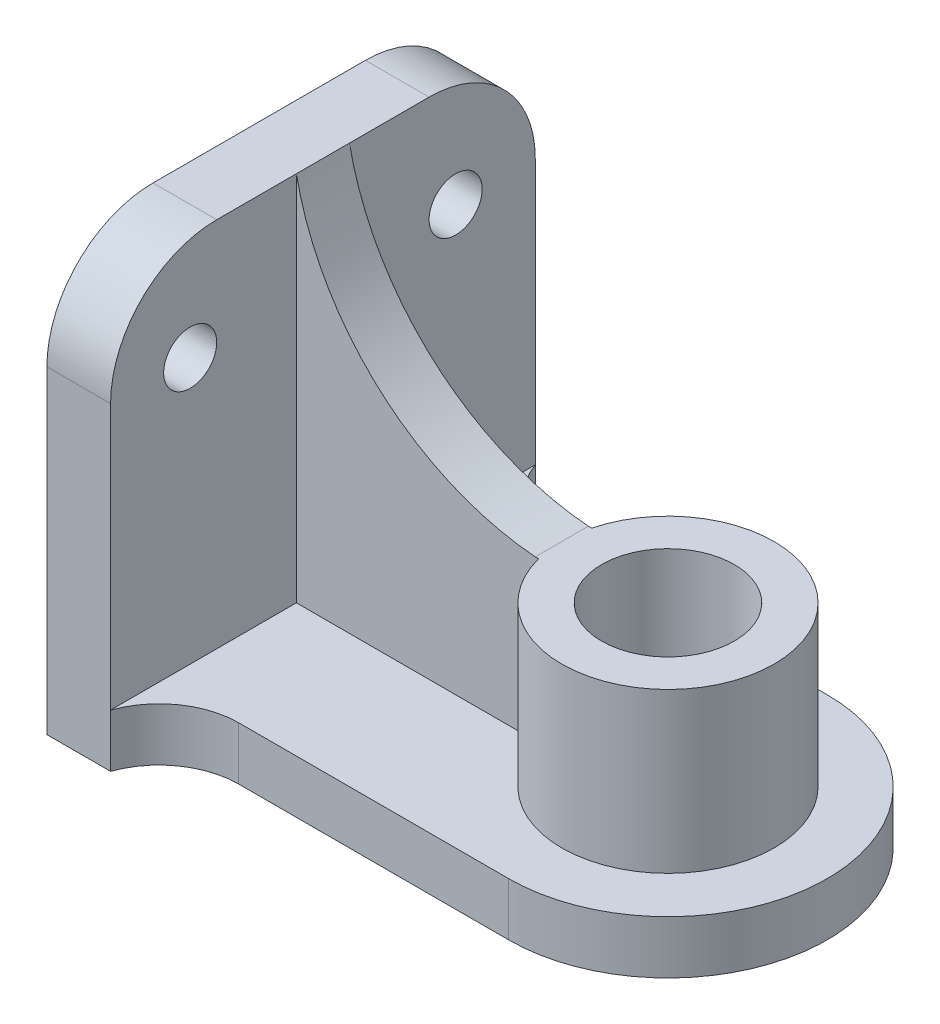
ISO-10303-21;
HEADER;
FILE_DESCRIPTION(('STEP AP214'),'2;1');
FILE_NAME('part.step','',(''),(''),'','','');
FILE_SCHEMA(('AUTOMOTIVE_DESIGN { 1 0 10303 214 1 1 1 1 }'));
ENDSEC;
DATA;
#1=APPLICATION_CONTEXT('core data for automotive mechanical design processes');
#2=APPLICATION_PROTOCOL_DEFINITION('international standard','automotive_design',2000,#1);
#3=PRODUCT_CONTEXT('',#1,'mechanical');
#4=PRODUCT('Part','Part','',(#3));
#5=PRODUCT_RELATED_PRODUCT_CATEGORY('part','',(#4));
#6=PRODUCT_DEFINITION_FORMATION('','',#4);
#7=PRODUCT_DEFINITION_CONTEXT('part definition',#1,'design');
#8=PRODUCT_DEFINITION('design','',#6,#7);
#9=PRODUCT_DEFINITION_SHAPE('','',#8);
#10=(LENGTH_UNIT() NAMED_UNIT(*) SI_UNIT(.MILLI.,.METRE.));
#11=(NAMED_UNIT(*) PLANE_ANGLE_UNIT() SI_UNIT($,.RADIAN.));
#12=(NAMED_UNIT(*) SI_UNIT($,.STERADIAN.) SOLID_ANGLE_UNIT());
#13=UNCERTAINTY_MEASURE_WITH_UNIT(LENGTH_MEASURE(1.E-05),#10,'distance_accuracy_value','');
#14=(GEOMETRIC_REPRESENTATION_CONTEXT(3) GLOBAL_UNCERTAINTY_ASSIGNED_CONTEXT((#13)) GLOBAL_UNIT_ASSIGNED_CONTEXT((#10,
#11,#12)) REPRESENTATION_CONTEXT('',''));
#15=CARTESIAN_POINT('',(0.,0.,0.));
#16=DIRECTION('',(0.,0.,1.));
#17=DIRECTION('',(1.,0.,0.));
#18=AXIS2_PLACEMENT_3D('',#15,#16,#17);
#19=CARTESIAN_POINT('',(12.,80.,0.));
#20=DIRECTION('',(-1.,0.,0.));
#21=DIRECTION('',(0.,0.,1.));
#22=AXIS2_PLACEMENT_3D('',#19,#20,#21);
#23=PLANE('',#22);
#24=CARTESIAN_POINT('',(12.,60.,15.));
#25=DIRECTION('',(1.,0.,0.));
#26=DIRECTION('',(0.,0.,-1.));
#27=AXIS2_PLACEMENT_3D('',#24,#25,#26);
#28=CIRCLE('',#27,5.);
#29=CARTESIAN_POINT('',(12.,60.,10.));
#30=VERTEX_POINT('',#29);
#31=EDGE_CURVE('E443',#30,#30,#28,.T.);
#32=ORIENTED_EDGE('',*,*,#31,.F.);
#33=EDGE_LOOP('',(#32));
#34=FACE_BOUND('',#33,.T.);
#35=DIRECTION('',(0.,-1.,0.));
#36=VECTOR('',#35,1.);
#37=CARTESIAN_POINT('',(12.,80.,35.));
#38=LINE('',#37,#36);
#39=CARTESIAN_POINT('',(12.,80.,35.));
#40=VERTEX_POINT('',#39);
#41=CARTESIAN_POINT('',(12.,10.,35.));
#42=VERTEX_POINT('',#41);
#43=EDGE_CURVE('E61',#40,#42,#38,.T.);
#44=ORIENTED_EDGE('',*,*,#43,.T.);
#45=DIRECTION('',(0.,0.,-1.));
#46=VECTOR('',#45,1.);
#47=CARTESIAN_POINT('',(12.,10.,0.));
#48=LINE('',#47,#46);
#49=CARTESIAN_POINT('',(12.,9.99999999999999,0.));
#50=VERTEX_POINT('',#49);
#51=EDGE_CURVE('E275',#42,#50,#48,.T.);
#52=ORIENTED_EDGE('',*,*,#51,.T.);
#53=DIRECTION('',(0.,-1.,0.));
#54=VECTOR('',#53,1.);
#55=CARTESIAN_POINT('',(12.,80.,0.));
#56=LINE('',#55,#54);
#57=CARTESIAN_POINT('',(12.,60.,0.));
#58=VERTEX_POINT('',#57);
#59=EDGE_CURVE('E252',#58,#50,#56,.T.);
#60=ORIENTED_EDGE('',*,*,#59,.F.);
#61=CARTESIAN_POINT('',(12.,60.,20.));
#62=DIRECTION('',(-1.,0.,0.));
#63=DIRECTION('',(0.,0.,1.));
#64=AXIS2_PLACEMENT_3D('',#61,#62,#63);
#65=CIRCLE('',#64,20.);
#66=CARTESIAN_POINT('',(12.,80.,20.));
#67=VERTEX_POINT('',#66);
#68=EDGE_CURVE('E54',#58,#67,#65,.F.);
#69=ORIENTED_EDGE('',*,*,#68,.T.);
#70=DIRECTION('',(0.,0.,-1.));
#71=VECTOR('',#70,1.);
#72=CARTESIAN_POINT('',(12.,80.,0.));
#73=LINE('',#72,#71);
#74=EDGE_CURVE('E233',#40,#67,#73,.T.);
#75=ORIENTED_EDGE('',*,*,#74,.F.);
#76=EDGE_LOOP('',(#44,#52,#60,#69,#75));
#77=FACE_BOUND('',#76,.T.);
#78=ADVANCED_FACE('F45',(#34,#77),#23,.F.);
#79=CARTESIAN_POINT('',(77.,10.,39.9999999999676));
#80=DIRECTION('',(0.,-1.,0.));
#81=DIRECTION('',(0.,0.,-1.));
#82=AXIS2_PLACEMENT_3D('',#79,#80,#81);
#83=CYLINDRICAL_SURFACE('',#82,30.);
#84=CARTESIAN_POINT('',(77.,0.,39.9999999999676));
#85=DIRECTION('',(0.,1.,0.));
#86=DIRECTION('',(0.,0.,1.));
#87=AXIS2_PLACEMENT_3D('',#84,#85,#86);
#88=CIRCLE('',#87,30.);
#89=CARTESIAN_POINT('',(77.,0.,69.9999999999676));
#90=VERTEX_POINT('',#89);
#91=CARTESIAN_POINT('',(77.,0.,9.9999999999676));
#92=VERTEX_POINT('',#91);
#93=EDGE_CURVE('E262',#90,#92,#88,.T.);
#94=ORIENTED_EDGE('',*,*,#93,.T.);
#95=DIRECTION('',(0.,-1.,0.));
#96=VECTOR('',#95,1.);
#97=CARTESIAN_POINT('',(77.,10.,9.9999999999676));
#98=LINE('',#97,#96);
#99=CARTESIAN_POINT('',(77.,10.,9.9999999999676));
#100=VERTEX_POINT('',#99);
#101=EDGE_CURVE('E323',#100,#92,#98,.T.);
#102=ORIENTED_EDGE('',*,*,#101,.F.);
#103=CARTESIAN_POINT('',(77.,10.,39.9999999999676));
#104=DIRECTION('',(0.,1.,0.));
#105=DIRECTION('',(0.,0.,1.));
#106=AXIS2_PLACEMENT_3D('',#103,#104,#105);
#107=CIRCLE('',#106,30.);
#108=CARTESIAN_POINT('',(77.,10.,69.9999999999676));
#109=VERTEX_POINT('',#108);
#110=EDGE_CURVE('E263',#109,#100,#107,.T.);
#111=ORIENTED_EDGE('',*,*,#110,.F.);
#112=DIRECTION('',(0.,-1.,0.));
#113=VECTOR('',#112,1.);
#114=CARTESIAN_POINT('',(77.,10.,69.9999999999676));
#115=LINE('',#114,#113);
#116=EDGE_CURVE('E290',#109,#90,#115,.T.);
#117=ORIENTED_EDGE('',*,*,#116,.T.);
#118=EDGE_LOOP('',(#94,#102,#111,#117));
#119=FACE_BOUND('',#118,.T.);
#120=ADVANCED_FACE('F398',(#119),#83,.T.);
#121=CARTESIAN_POINT('',(6.36887866620817E-12,10.,10.0000000000166));
#122=DIRECTION('',(6.36887866619757E-13,0.,1.));
#123=DIRECTION('',(1.,0.,-6.36887866619757E-13));
#124=AXIS2_PLACEMENT_3D('',#121,#122,#123);
#125=PLANE('',#124);
#126=DIRECTION('',(-1.,0.,6.36887866619757E-13));
#127=VECTOR('',#126,1.);
#128=CARTESIAN_POINT('',(6.36887866620817E-12,0.,10.0000000000166));
#129=LINE('',#128,#127);
#130=CARTESIAN_POINT('',(26.1421356237309,0.,9.99999999999999));
#131=VERTEX_POINT('',#130);
#132=EDGE_CURVE('E294',#92,#131,#129,.T.);
#133=ORIENTED_EDGE('',*,*,#132,.T.);
#134=DIRECTION('',(0.,-1.,0.));
#135=VECTOR('',#134,1.);
#136=CARTESIAN_POINT('',(26.1421356237309,10.,9.99999999999999));
#137=LINE('',#136,#135);
#138=CARTESIAN_POINT('',(26.1421356237309,10.,9.99999999999999));
#139=VERTEX_POINT('',#138);
#140=EDGE_CURVE('E319',#139,#131,#137,.T.);
#141=ORIENTED_EDGE('',*,*,#140,.F.);
#142=DIRECTION('',(-1.,0.,6.36887866619757E-13));
#143=VECTOR('',#142,1.);
#144=CARTESIAN_POINT('',(6.36887866620817E-12,10.,10.0000000000166));
#145=LINE('',#144,#143);
#146=EDGE_CURVE('E267',#100,#139,#145,.T.);
#147=ORIENTED_EDGE('',*,*,#146,.F.);
#148=ORIENTED_EDGE('',*,*,#101,.T.);
#149=EDGE_LOOP('',(#133,#141,#147,#148));
#150=FACE_BOUND('',#149,.T.);
#151=ADVANCED_FACE('F394',(#150),#125,.F.);
#152=CARTESIAN_POINT('',(26.142135623731,10.,-5.));
#153=DIRECTION('',(0.,-1.,0.));
#154=DIRECTION('',(0.,0.,-1.));
#155=AXIS2_PLACEMENT_3D('',#152,#153,#154);
#156=CYLINDRICAL_SURFACE('',#155,15.);
#157=CARTESIAN_POINT('',(26.142135623731,0.,-5.));
#158=DIRECTION('',(0.,1.,0.));
#159=DIRECTION('',(0.,0.,1.));
#160=AXIS2_PLACEMENT_3D('',#157,#158,#159);
#161=CIRCLE('',#160,15.);
#162=CARTESIAN_POINT('',(12.,0.,0.));
#163=VERTEX_POINT('',#162);
#164=EDGE_CURVE('E297',#131,#163,#161,.F.);
#165=ORIENTED_EDGE('',*,*,#164,.T.);
#166=DIRECTION('',(0.,-1.,0.));
#167=VECTOR('',#166,1.);
#168=CARTESIAN_POINT('',(12.,10.,0.));
#169=LINE('',#168,#167);
#170=EDGE_CURVE('E315',#50,#163,#169,.T.);
#171=ORIENTED_EDGE('',*,*,#170,.F.);
#172=CARTESIAN_POINT('',(26.142135623731,10.,-5.));
#173=DIRECTION('',(0.,1.,0.));
#174=DIRECTION('',(0.,0.,1.));
#175=AXIS2_PLACEMENT_3D('',#172,#173,#174);
#176=CIRCLE('',#175,15.);
#177=EDGE_CURVE('E271',#139,#50,#176,.F.);
#178=ORIENTED_EDGE('',*,*,#177,.F.);
#179=ORIENTED_EDGE('',*,*,#140,.T.);
#180=EDGE_LOOP('',(#165,#171,#178,#179));
#181=FACE_BOUND('',#180,.T.);
#182=ADVANCED_FACE('F390',(#181),#156,.F.);
#183=CARTESIAN_POINT('',(26.142135623731,10.,85.));
#184=DIRECTION('',(0.,-1.,0.));
#185=DIRECTION('',(0.,0.,-1.));
#186=AXIS2_PLACEMENT_3D('',#183,#184,#185);
#187=CYLINDRICAL_SURFACE('',#186,15.);
#188=CARTESIAN_POINT('',(26.142135623731,0.,85.));
#189=DIRECTION('',(0.,1.,0.));
#190=DIRECTION('',(0.,0.,1.));
#191=AXIS2_PLACEMENT_3D('',#188,#189,#190);
#192=CIRCLE('',#191,15.);
#193=CARTESIAN_POINT('',(26.1421356237309,0.,70.));
#194=VERTEX_POINT('',#193);
#195=CARTESIAN_POINT('',(12.,0.,80.));
#196=VERTEX_POINT('',#195);
#197=EDGE_CURVE('E300',#194,#196,#192,.T.);
#198=ORIENTED_EDGE('',*,*,#197,.F.);
#199=DIRECTION('',(0.,-1.,0.));
#200=VECTOR('',#199,1.);
#201=CARTESIAN_POINT('',(26.1421356237309,10.,70.));
#202=LINE('',#201,#200);
#203=CARTESIAN_POINT('',(26.1421356237309,10.,70.));
#204=VERTEX_POINT('',#203);
#205=EDGE_CURVE('E309',#204,#194,#202,.T.);
#206=ORIENTED_EDGE('',*,*,#205,.F.);
#207=CARTESIAN_POINT('',(26.142135623731,10.,85.));
#208=DIRECTION('',(0.,1.,0.));
#209=DIRECTION('',(0.,0.,1.));
#210=AXIS2_PLACEMENT_3D('',#207,#208,#209);
#211=CIRCLE('',#210,15.);
#212=CARTESIAN_POINT('',(12.,10.,80.));
#213=VERTEX_POINT('',#212);
#214=EDGE_CURVE('E279',#204,#213,#211,.T.);
#215=ORIENTED_EDGE('',*,*,#214,.T.);
#216=DIRECTION('',(0.,-1.,0.));
#217=VECTOR('',#216,1.);
#218=CARTESIAN_POINT('',(12.,10.,80.));
#219=LINE('',#218,#217);
#220=EDGE_CURVE('E312',#213,#196,#219,.T.);
#221=ORIENTED_EDGE('',*,*,#220,.T.);
#222=EDGE_LOOP('',(#198,#206,#215,#221));
#223=FACE_BOUND('',#222,.T.);
#224=ADVANCED_FACE('F375',(#223),#187,.F.);
#225=CARTESIAN_POINT('',(4.46012518419127E-11,10.,70.0000000000167));
#226=DIRECTION('',(6.37160740598601E-13,0.,1.));
#227=DIRECTION('',(1.,0.,-6.37160740598601E-13));
#228=AXIS2_PLACEMENT_3D('',#225,#226,#227);
#229=PLANE('',#228);
#230=DIRECTION('',(-1.,0.,6.37160740598601E-13));
#231=VECTOR('',#230,1.);
#232=CARTESIAN_POINT('',(4.46012518419127E-11,0.,70.0000000000167));
#233=LINE('',#232,#231);
#234=EDGE_CURVE('E268',#90,#194,#233,.T.);
#235=ORIENTED_EDGE('',*,*,#234,.F.);
#236=ORIENTED_EDGE('',*,*,#116,.F.);
#237=DIRECTION('',(-1.,0.,6.37160740598601E-13));
#238=VECTOR('',#237,1.);
#239=CARTESIAN_POINT('',(4.46012518419127E-11,10.,70.0000000000167));
#240=LINE('',#239,#238);
#241=EDGE_CURVE('E283',#109,#204,#240,.T.);
#242=ORIENTED_EDGE('',*,*,#241,.T.);
#243=ORIENTED_EDGE('',*,*,#205,.T.);
#244=EDGE_LOOP('',(#235,#236,#242,#243));
#245=FACE_BOUND('',#244,.T.);
#246=ADVANCED_FACE('F401',(#245),#229,.T.);
#247=CARTESIAN_POINT('',(0.,10.,0.));
#248=DIRECTION('',(0.,1.,0.));
#249=DIRECTION('',(0.,0.,1.));
#250=AXIS2_PLACEMENT_3D('',#247,#248,#249);
#251=PLANE('',#250);
#252=DIRECTION('',(1.,0.,0.));
#253=VECTOR('',#252,1.);
#254=CARTESIAN_POINT('',(12.,9.99999999999999,45.));
#255=LINE('',#254,#253);
#256=CARTESIAN_POINT('',(12.,10.,45.));
#257=VERTEX_POINT('',#256);
#258=CARTESIAN_POINT('',(57.6350832689713,10.,45.));
#259=VERTEX_POINT('',#258);
#260=EDGE_CURVE('E69',#257,#259,#255,.T.);
#261=ORIENTED_EDGE('',*,*,#260,.F.);
#262=EDGE_CURVE('E276',#213,#257,#48,.T.);
#263=ORIENTED_EDGE('',*,*,#262,.F.);
#264=ORIENTED_EDGE('',*,*,#214,.F.);
#265=ORIENTED_EDGE('',*,*,#241,.F.);
#266=ORIENTED_EDGE('',*,*,#110,.T.);
#267=ORIENTED_EDGE('',*,*,#146,.T.);
#268=ORIENTED_EDGE('',*,*,#177,.T.);
#269=ORIENTED_EDGE('',*,*,#51,.F.);
#270=DIRECTION('',(1.,0.,0.));
#271=VECTOR('',#270,1.);
#272=CARTESIAN_POINT('',(57.,10.,35.));
#273=LINE('',#272,#271);
#274=CARTESIAN_POINT('',(57.6350832689545,10.,35.));
#275=VERTEX_POINT('',#274);
#276=EDGE_CURVE('E192',#42,#275,#273,.T.);
#277=ORIENTED_EDGE('',*,*,#276,.T.);
#278=CARTESIAN_POINT('',(77.,10.,39.9999999999676));
#279=DIRECTION('',(0.,1.,0.));
#280=DIRECTION('',(0.,0.,1.));
#281=AXIS2_PLACEMENT_3D('',#278,#279,#280);
#282=CIRCLE('',#281,20.);
#283=EDGE_CURVE('E287',#259,#275,#282,.T.);
#284=ORIENTED_EDGE('',*,*,#283,.F.);
#285=EDGE_LOOP('',(#261,#263,#264,#265,#266,#267,#268,#269,#277,#284));
#286=FACE_BOUND('',#285,.T.);
#287=ADVANCED_FACE('F370',(#286),#251,.T.);
#288=CARTESIAN_POINT('',(0.,0.,0.));
#289=DIRECTION('',(0.,1.,0.));
#290=DIRECTION('',(0.,0.,1.));
#291=AXIS2_PLACEMENT_3D('',#288,#289,#290);
#292=PLANE('',#291);
#293=ORIENTED_EDGE('',*,*,#93,.F.);
#294=ORIENTED_EDGE('',*,*,#234,.T.);
#295=ORIENTED_EDGE('',*,*,#197,.T.);
#296=DIRECTION('',(1.,0.,0.));
#297=VECTOR('',#296,1.);
#298=CARTESIAN_POINT('',(0.,0.,80.));
#299=LINE('',#298,#297);
#300=CARTESIAN_POINT('',(0.,0.,80.));
#301=VERTEX_POINT('',#300);
#302=EDGE_CURVE('E243',#301,#196,#299,.T.);
#303=ORIENTED_EDGE('',*,*,#302,.F.);
#304=DIRECTION('',(0.,0.,1.));
#305=VECTOR('',#304,1.);
#306=CARTESIAN_POINT('',(0.,0.,0.));
#307=LINE('',#306,#305);
#308=CARTESIAN_POINT('',(0.,0.,0.));
#309=VERTEX_POINT('',#308);
#310=EDGE_CURVE('E225',#309,#301,#307,.T.);
#311=ORIENTED_EDGE('',*,*,#310,.F.);
#312=DIRECTION('',(-1.,0.,0.));
#313=VECTOR('',#312,1.);
#314=CARTESIAN_POINT('',(0.,0.,0.));
#315=LINE('',#314,#313);
#316=EDGE_CURVE('E234',#163,#309,#315,.T.);
#317=ORIENTED_EDGE('',*,*,#316,.F.);
#318=ORIENTED_EDGE('',*,*,#164,.F.);
#319=ORIENTED_EDGE('',*,*,#132,.F.);
#320=EDGE_LOOP('',(#293,#294,#295,#303,#311,#317,#318,#319));
#321=FACE_BOUND('',#320,.T.);
#322=CARTESIAN_POINT('',(77.,0.,39.9999999999676));
#323=DIRECTION('',(0.,1.,0.));
#324=DIRECTION('',(0.,0.,1.));
#325=AXIS2_PLACEMENT_3D('',#322,#323,#324);
#326=CIRCLE('',#325,12.5);
#327=CARTESIAN_POINT('',(77.,0.,52.4999999999676));
#328=VERTEX_POINT('',#327);
#329=EDGE_CURVE('E217',#328,#328,#326,.T.);
#330=ORIENTED_EDGE('',*,*,#329,.T.);
#331=EDGE_LOOP('',(#330));
#332=FACE_BOUND('',#331,.T.);
#333=ADVANCED_FACE('F382',(#321,#332),#292,.F.);
#334=CARTESIAN_POINT('',(12.,60.,65.));
#335=DIRECTION('',(1.,0.,0.));
#336=DIRECTION('',(0.,0.,-1.));
#337=AXIS2_PLACEMENT_3D('',#334,#335,#336);
#338=CIRCLE('',#337,5.00000000000001);
#339=CARTESIAN_POINT('',(12.,60.,60.));
#340=VERTEX_POINT('',#339);
#341=EDGE_CURVE('E440',#340,#340,#338,.T.);
#342=ORIENTED_EDGE('',*,*,#341,.F.);
#343=EDGE_LOOP('',(#342));
#344=FACE_BOUND('',#343,.T.);
#345=ORIENTED_EDGE('',*,*,#262,.T.);
#346=DIRECTION('',(0.,-1.,0.));
#347=VECTOR('',#346,1.);
#348=CARTESIAN_POINT('',(12.,80.,45.));
#349=LINE('',#348,#347);
#350=CARTESIAN_POINT('',(12.,80.,45.));
#351=VERTEX_POINT('',#350);
#352=EDGE_CURVE('E187',#351,#257,#349,.T.);
#353=ORIENTED_EDGE('',*,*,#352,.F.);
#354=CARTESIAN_POINT('',(12.,80.,60.));
#355=VERTEX_POINT('',#354);
#356=EDGE_CURVE('E235',#355,#351,#73,.T.);
#357=ORIENTED_EDGE('',*,*,#356,.F.);
#358=CARTESIAN_POINT('',(12.,60.,60.));
#359=DIRECTION('',(-1.,0.,0.));
#360=DIRECTION('',(0.,0.,1.));
#361=AXIS2_PLACEMENT_3D('',#358,#359,#360);
#362=CIRCLE('',#361,20.);
#363=CARTESIAN_POINT('',(12.,60.,80.));
#364=VERTEX_POINT('',#363);
#365=EDGE_CURVE('E344',#355,#364,#362,.F.);
#366=ORIENTED_EDGE('',*,*,#365,.T.);
#367=DIRECTION('',(0.,-1.,0.));
#368=VECTOR('',#367,1.);
#369=CARTESIAN_POINT('',(12.,80.,80.));
#370=LINE('',#369,#368);
#371=EDGE_CURVE('E256',#364,#213,#370,.T.);
#372=ORIENTED_EDGE('',*,*,#371,.T.);
#373=EDGE_LOOP('',(#345,#353,#357,#366,#372));
#374=FACE_BOUND('',#373,.T.);
#375=ADVANCED_FACE('F367',(#344,#374),#23,.F.);
#376=CARTESIAN_POINT('',(0.,80.,0.));
#377=DIRECTION('',(1.,0.,0.));
#378=DIRECTION('',(0.,0.,-1.));
#379=AXIS2_PLACEMENT_3D('',#376,#377,#378);
#380=PLANE('',#379);
#381=CARTESIAN_POINT('',(0.,60.,65.));
#382=DIRECTION('',(1.,0.,0.));
#383=DIRECTION('',(0.,0.,-1.));
#384=AXIS2_PLACEMENT_3D('',#381,#382,#383);
#385=CIRCLE('',#384,5.00000000000001);
#386=CARTESIAN_POINT('',(0.,60.,60.));
#387=VERTEX_POINT('',#386);
#388=EDGE_CURVE('E203',#387,#387,#385,.T.);
#389=ORIENTED_EDGE('',*,*,#388,.T.);
#390=EDGE_LOOP('',(#389));
#391=FACE_BOUND('',#390,.T.);
#392=CARTESIAN_POINT('',(0.,60.,15.));
#393=DIRECTION('',(1.,0.,0.));
#394=DIRECTION('',(0.,0.,-1.));
#395=AXIS2_PLACEMENT_3D('',#392,#393,#394);
#396=CIRCLE('',#395,5.);
#397=CARTESIAN_POINT('',(0.,60.,10.));
#398=VERTEX_POINT('',#397);
#399=EDGE_CURVE('E195',#398,#398,#396,.T.);
#400=ORIENTED_EDGE('',*,*,#399,.T.);
#401=EDGE_LOOP('',(#400));
#402=FACE_BOUND('',#401,.T.);
#403=DIRECTION('',(0.,0.,1.));
#404=VECTOR('',#403,1.);
#405=CARTESIAN_POINT('',(0.,80.,0.));
#406=LINE('',#405,#404);
#407=CARTESIAN_POINT('',(0.,80.,20.));
#408=VERTEX_POINT('',#407);
#409=CARTESIAN_POINT('',(0.,80.,60.));
#410=VERTEX_POINT('',#409);
#411=EDGE_CURVE('E229',#408,#410,#406,.T.);
#412=ORIENTED_EDGE('',*,*,#411,.F.);
#413=CARTESIAN_POINT('',(0.,60.,20.));
#414=DIRECTION('',(1.,0.,0.));
#415=DIRECTION('',(0.,0.,-1.));
#416=AXIS2_PLACEMENT_3D('',#413,#414,#415);
#417=CIRCLE('',#416,20.);
#418=CARTESIAN_POINT('',(0.,60.,0.));
#419=VERTEX_POINT('',#418);
#420=EDGE_CURVE('E338',#408,#419,#417,.F.);
#421=ORIENTED_EDGE('',*,*,#420,.T.);
#422=DIRECTION('',(0.,-1.,0.));
#423=VECTOR('',#422,1.);
#424=CARTESIAN_POINT('',(0.,80.,0.));
#425=LINE('',#424,#423);
#426=EDGE_CURVE('E239',#419,#309,#425,.T.);
#427=ORIENTED_EDGE('',*,*,#426,.T.);
#428=ORIENTED_EDGE('',*,*,#310,.T.);
#429=DIRECTION('',(0.,-1.,0.));
#430=VECTOR('',#429,1.);
#431=CARTESIAN_POINT('',(0.,80.,80.));
#432=LINE('',#431,#430);
#433=CARTESIAN_POINT('',(0.,60.,80.));
#434=VERTEX_POINT('',#433);
#435=EDGE_CURVE('E259',#434,#301,#432,.T.);
#436=ORIENTED_EDGE('',*,*,#435,.F.);
#437=CARTESIAN_POINT('',(0.,60.,60.));
#438=DIRECTION('',(1.,0.,0.));
#439=DIRECTION('',(0.,0.,-1.));
#440=AXIS2_PLACEMENT_3D('',#437,#438,#439);
#441=CIRCLE('',#440,20.);
#442=EDGE_CURVE('E335',#434,#410,#441,.F.);
#443=ORIENTED_EDGE('',*,*,#442,.T.);
#444=EDGE_LOOP('',(#412,#421,#427,#428,#436,#443));
#445=FACE_BOUND('',#444,.T.);
#446=ADVANCED_FACE('F359',(#391,#402,#445),#380,.F.);
#447=CARTESIAN_POINT('',(0.,80.,80.));
#448=DIRECTION('',(0.,0.,-1.));
#449=DIRECTION('',(-1.,0.,0.));
#450=AXIS2_PLACEMENT_3D('',#447,#448,#449);
#451=PLANE('',#450);
#452=ORIENTED_EDGE('',*,*,#371,.F.);
#453=DIRECTION('',(1.,0.,0.));
#454=VECTOR('',#453,1.);
#455=CARTESIAN_POINT('',(0.,60.,80.));
#456=LINE('',#455,#454);
#457=EDGE_CURVE('E11',#364,#434,#456,.F.);
#458=ORIENTED_EDGE('',*,*,#457,.T.);
#459=ORIENTED_EDGE('',*,*,#435,.T.);
#460=ORIENTED_EDGE('',*,*,#302,.T.);
#461=ORIENTED_EDGE('',*,*,#220,.F.);
#462=EDGE_LOOP('',(#452,#458,#459,#460,#461));
#463=FACE_BOUND('',#462,.T.);
#464=ADVANCED_FACE('F377',(#463),#451,.F.);
#465=CARTESIAN_POINT('',(0.,80.,0.));
#466=DIRECTION('',(0.,0.,1.));
#467=DIRECTION('',(1.,0.,0.));
#468=AXIS2_PLACEMENT_3D('',#465,#466,#467);
#469=PLANE('',#468);
#470=ORIENTED_EDGE('',*,*,#426,.F.);
#471=DIRECTION('',(-1.,0.,0.));
#472=VECTOR('',#471,1.);
#473=CARTESIAN_POINT('',(12.,60.,0.));
#474=LINE('',#473,#472);
#475=EDGE_CURVE('E341',#419,#58,#474,.F.);
#476=ORIENTED_EDGE('',*,*,#475,.T.);
#477=ORIENTED_EDGE('',*,*,#59,.T.);
#478=ORIENTED_EDGE('',*,*,#170,.T.);
#479=ORIENTED_EDGE('',*,*,#316,.T.);
#480=EDGE_LOOP('',(#470,#476,#477,#478,#479));
#481=FACE_BOUND('',#480,.T.);
#482=ADVANCED_FACE('F386',(#481),#469,.F.);
#483=CARTESIAN_POINT('',(0.,80.,0.));
#484=DIRECTION('',(0.,1.,0.));
#485=DIRECTION('',(0.,0.,1.));
#486=AXIS2_PLACEMENT_3D('',#483,#484,#485);
#487=PLANE('',#486);
#488=ORIENTED_EDGE('',*,*,#356,.T.);
#489=DIRECTION('',(0.,0.,-1.));
#490=VECTOR('',#489,1.);
#491=CARTESIAN_POINT('',(12.,80.,45.));
#492=LINE('',#491,#490);
#493=EDGE_CURVE('E182',#351,#40,#492,.T.);
#494=ORIENTED_EDGE('',*,*,#493,.T.);
#495=ORIENTED_EDGE('',*,*,#74,.T.);
#496=DIRECTION('',(-1.,0.,0.));
#497=VECTOR('',#496,1.);
#498=CARTESIAN_POINT('',(0.,80.,20.));
#499=LINE('',#498,#497);
#500=EDGE_CURVE('E331',#67,#408,#499,.T.);
#501=ORIENTED_EDGE('',*,*,#500,.T.);
#502=ORIENTED_EDGE('',*,*,#411,.T.);
#503=DIRECTION('',(1.,0.,0.));
#504=VECTOR('',#503,1.);
#505=CARTESIAN_POINT('',(12.,80.,60.));
#506=LINE('',#505,#504);
#507=EDGE_CURVE('E327',#410,#355,#506,.T.);
#508=ORIENTED_EDGE('',*,*,#507,.T.);
#509=EDGE_LOOP('',(#488,#494,#495,#501,#502,#508));
#510=FACE_BOUND('',#509,.T.);
#511=ADVANCED_FACE('F356',(#510),#487,.T.);
#512=CARTESIAN_POINT('',(0.,60.,20.));
#513=DIRECTION('',(1.,0.,0.));
#514=DIRECTION('',(0.,0.,-1.));
#515=AXIS2_PLACEMENT_3D('',#512,#513,#514);
#516=CYLINDRICAL_SURFACE('',#515,20.);
#517=ORIENTED_EDGE('',*,*,#68,.F.);
#518=ORIENTED_EDGE('',*,*,#475,.F.);
#519=ORIENTED_EDGE('',*,*,#420,.F.);
#520=ORIENTED_EDGE('',*,*,#500,.F.);
#521=EDGE_LOOP('',(#517,#518,#519,#520));
#522=FACE_BOUND('',#521,.T.);
#523=ADVANCED_FACE('F353',(#522),#516,.T.);
#524=CARTESIAN_POINT('',(0.,60.,60.));
#525=DIRECTION('',(-1.,0.,0.));
#526=DIRECTION('',(0.,0.,1.));
#527=AXIS2_PLACEMENT_3D('',#524,#525,#526);
#528=CYLINDRICAL_SURFACE('',#527,20.);
#529=ORIENTED_EDGE('',*,*,#442,.F.);
#530=ORIENTED_EDGE('',*,*,#457,.F.);
#531=ORIENTED_EDGE('',*,*,#365,.F.);
#532=ORIENTED_EDGE('',*,*,#507,.F.);
#533=EDGE_LOOP('',(#529,#530,#531,#532));
#534=FACE_BOUND('',#533,.T.);
#535=ADVANCED_FACE('F47',(#534),#528,.T.);
#536=CARTESIAN_POINT('',(77.,40.,39.9999999999676));
#537=DIRECTION('',(0.,-1.,0.));
#538=DIRECTION('',(0.,0.,-1.));
#539=AXIS2_PLACEMENT_3D('',#536,#537,#538);
#540=CYLINDRICAL_SURFACE('',#539,12.5);
#541=CARTESIAN_POINT('',(77.,40.,39.9999999999676));
#542=DIRECTION('',(0.,1.,0.));
#543=DIRECTION('',(0.,0.,1.));
#544=AXIS2_PLACEMENT_3D('',#541,#542,#543);
#545=CIRCLE('',#544,12.5);
#546=CARTESIAN_POINT('',(77.,40.,52.4999999999676));
#547=VERTEX_POINT('',#546);
#548=EDGE_CURVE('E218',#547,#547,#545,.T.);
#549=ORIENTED_EDGE('',*,*,#548,.T.);
#550=EDGE_LOOP('',(#549));
#551=FACE_BOUND('',#550,.T.);
#552=ORIENTED_EDGE('',*,*,#329,.F.);
#553=EDGE_LOOP('',(#552));
#554=FACE_BOUND('',#553,.T.);
#555=ADVANCED_FACE('F409',(#551,#554),#540,.F.);
#556=CARTESIAN_POINT('',(77.,40.,39.9999999999676));
#557=DIRECTION('',(0.,-1.,0.));
#558=DIRECTION('',(0.,0.,-1.));
#559=AXIS2_PLACEMENT_3D('',#556,#557,#558);
#560=CYLINDRICAL_SURFACE('',#559,20.);
#561=CARTESIAN_POINT('',(77.,40.,39.9999999999676));
#562=DIRECTION('',(0.,1.,0.));
#563=DIRECTION('',(0.,0.,1.));
#564=AXIS2_PLACEMENT_3D('',#561,#562,#563);
#565=CIRCLE('',#564,20.);
#566=CARTESIAN_POINT('',(57.6350832689713,40.,45.));
#567=VERTEX_POINT('',#566);
#568=CARTESIAN_POINT('',(57.6350832689545,40.,35.));
#569=VERTEX_POINT('',#568);
#570=EDGE_CURVE('E222',#567,#569,#565,.T.);
#571=ORIENTED_EDGE('',*,*,#570,.F.);
#572=DIRECTION('',(0.,-1.,0.));
#573=VECTOR('',#572,1.);
#574=CARTESIAN_POINT('',(57.6350832689713,40.,45.));
#575=LINE('',#574,#573);
#576=EDGE_CURVE('E168',#567,#259,#575,.T.);
#577=ORIENTED_EDGE('',*,*,#576,.T.);
#578=ORIENTED_EDGE('',*,*,#283,.T.);
#579=DIRECTION('',(0.,-1.,0.));
#580=VECTOR('',#579,1.);
#581=CARTESIAN_POINT('',(57.6350832689545,40.,35.));
#582=LINE('',#581,#580);
#583=EDGE_CURVE('E211',#569,#275,#582,.T.);
#584=ORIENTED_EDGE('',*,*,#583,.F.);
#585=EDGE_LOOP('',(#571,#577,#578,#584));
#586=FACE_BOUND('',#585,.T.);
#587=ADVANCED_FACE('F407',(#586),#560,.T.);
#588=CARTESIAN_POINT('',(0.,40.,0.));
#589=DIRECTION('',(0.,1.,0.));
#590=DIRECTION('',(0.,0.,1.));
#591=AXIS2_PLACEMENT_3D('',#588,#589,#590);
#592=PLANE('',#591);
#593=ORIENTED_EDGE('',*,*,#548,.F.);
#594=EDGE_LOOP('',(#593));
#595=FACE_BOUND('',#594,.T.);
#596=DIRECTION('',(-1.,0.,0.));
#597=VECTOR('',#596,1.);
#598=CARTESIAN_POINT('',(57.,40.,35.));
#599=LINE('',#598,#597);
#600=CARTESIAN_POINT('',(57.,40.,35.));
#601=VERTEX_POINT('',#600);
#602=EDGE_CURVE('E177',#569,#601,#599,.T.);
#603=ORIENTED_EDGE('',*,*,#602,.T.);
#604=DIRECTION('',(0.,0.,-1.));
#605=VECTOR('',#604,1.);
#606=CARTESIAN_POINT('',(57.,40.,45.));
#607=LINE('',#606,#605);
#608=CARTESIAN_POINT('',(57.,40.,45.));
#609=VERTEX_POINT('',#608);
#610=EDGE_CURVE('E172',#609,#601,#607,.T.);
#611=ORIENTED_EDGE('',*,*,#610,.F.);
#612=DIRECTION('',(-1.,0.,0.));
#613=VECTOR('',#612,1.);
#614=CARTESIAN_POINT('',(57.,40.,45.));
#615=LINE('',#614,#613);
#616=EDGE_CURVE('E161',#567,#609,#615,.T.);
#617=ORIENTED_EDGE('',*,*,#616,.F.);
#618=ORIENTED_EDGE('',*,*,#570,.T.);
#619=EDGE_LOOP('',(#603,#611,#617,#618));
#620=FACE_BOUND('',#619,.T.);
#621=ADVANCED_FACE('F175',(#595,#620),#592,.T.);
#622=CARTESIAN_POINT('',(61.0225993421095,89.8379242598732,45.));
#623=DIRECTION('',(0.,0.,1.));
#624=DIRECTION('',(1.,0.,0.));
#625=AXIS2_PLACEMENT_3D('',#622,#623,#624);
#626=PLANE('',#625);
#627=ORIENTED_EDGE('',*,*,#576,.F.);
#628=ORIENTED_EDGE('',*,*,#616,.T.);
#629=CARTESIAN_POINT('',(61.0225993421095,89.8379242598732,45.));
#630=DIRECTION('',(0.,0.,-1.));
#631=DIRECTION('',(1.,0.,0.));
#632=AXIS2_PLACEMENT_3D('',#629,#630,#631);
#633=CIRCLE('',#632,50.);
#634=EDGE_CURVE('E166',#609,#351,#633,.T.);
#635=ORIENTED_EDGE('',*,*,#634,.T.);
#636=ORIENTED_EDGE('',*,*,#352,.T.);
#637=ORIENTED_EDGE('',*,*,#260,.T.);
#638=EDGE_LOOP('',(#627,#628,#635,#636,#637));
#639=FACE_BOUND('',#638,.T.);
#640=ADVANCED_FACE('F163',(#639),#626,.T.);
#641=CARTESIAN_POINT('',(61.0225993421095,89.8379242598732,35.));
#642=DIRECTION('',(0.,0.,1.));
#643=DIRECTION('',(1.,0.,0.));
#644=AXIS2_PLACEMENT_3D('',#641,#642,#643);
#645=PLANE('',#644);
#646=ORIENTED_EDGE('',*,*,#602,.F.);
#647=ORIENTED_EDGE('',*,*,#583,.T.);
#648=ORIENTED_EDGE('',*,*,#276,.F.);
#649=ORIENTED_EDGE('',*,*,#43,.F.);
#650=CARTESIAN_POINT('',(61.0225993421095,89.8379242598732,35.));
#651=DIRECTION('',(0.,0.,-1.));
#652=DIRECTION('',(1.,0.,0.));
#653=AXIS2_PLACEMENT_3D('',#650,#651,#652);
#654=CIRCLE('',#653,50.);
#655=EDGE_CURVE('E200',#601,#40,#654,.T.);
#656=ORIENTED_EDGE('',*,*,#655,.F.);
#657=EDGE_LOOP('',(#646,#647,#648,#649,#656));
#658=FACE_BOUND('',#657,.T.);
#659=ADVANCED_FACE('F405',(#658),#645,.F.);
#660=CARTESIAN_POINT('',(61.0225993421095,89.8379242598732,45.));
#661=DIRECTION('',(0.,0.,-1.));
#662=DIRECTION('',(-1.,0.,0.));
#663=AXIS2_PLACEMENT_3D('',#660,#661,#662);
#664=CYLINDRICAL_SURFACE('',#663,50.);
#665=ORIENTED_EDGE('',*,*,#655,.T.);
#666=ORIENTED_EDGE('',*,*,#493,.F.);
#667=ORIENTED_EDGE('',*,*,#634,.F.);
#668=ORIENTED_EDGE('',*,*,#610,.T.);
#669=EDGE_LOOP('',(#665,#666,#667,#668));
#670=FACE_BOUND('',#669,.T.);
#671=ADVANCED_FACE('F184',(#670),#664,.F.);
#672=CARTESIAN_POINT('',(0.,60.,15.));
#673=DIRECTION('',(1.,0.,0.));
#674=DIRECTION('',(0.,0.,-1.));
#675=AXIS2_PLACEMENT_3D('',#672,#673,#674);
#676=CYLINDRICAL_SURFACE('',#675,5.);
#677=ORIENTED_EDGE('',*,*,#399,.F.);
#678=EDGE_LOOP('',(#677));
#679=FACE_BOUND('',#678,.T.);
#680=ORIENTED_EDGE('',*,*,#31,.T.);
#681=EDGE_LOOP('',(#680));
#682=FACE_BOUND('',#681,.T.);
#683=ADVANCED_FACE('F456',(#679,#682),#676,.F.);
#684=CARTESIAN_POINT('',(0.,60.,65.));
#685=DIRECTION('',(1.,0.,0.));
#686=DIRECTION('',(0.,0.,-1.));
#687=AXIS2_PLACEMENT_3D('',#684,#685,#686);
#688=CYLINDRICAL_SURFACE('',#687,5.00000000000001);
#689=ORIENTED_EDGE('',*,*,#388,.F.);
#690=EDGE_LOOP('',(#689));
#691=FACE_BOUND('',#690,.T.);
#692=ORIENTED_EDGE('',*,*,#341,.T.);
#693=EDGE_LOOP('',(#692));
#694=FACE_BOUND('',#693,.T.);
#695=ADVANCED_FACE('F458',(#691,#694),#688,.F.);
#696=CLOSED_SHELL('',(#78,#120,#151,#182,#224,#246,#287,#333,#375,#446,#464,#482,#511,#523,#535,
#555,#587,#621,#640,#659,#671,#683,#695));
#697=MANIFOLD_SOLID_BREP('B2',#696);
#698=ADVANCED_BREP_SHAPE_REPRESENTATION('',(#18,#697),#14);
#699=SHAPE_DEFINITION_REPRESENTATION(#9,#698);
ENDSEC;
END-ISO-10303-21;
